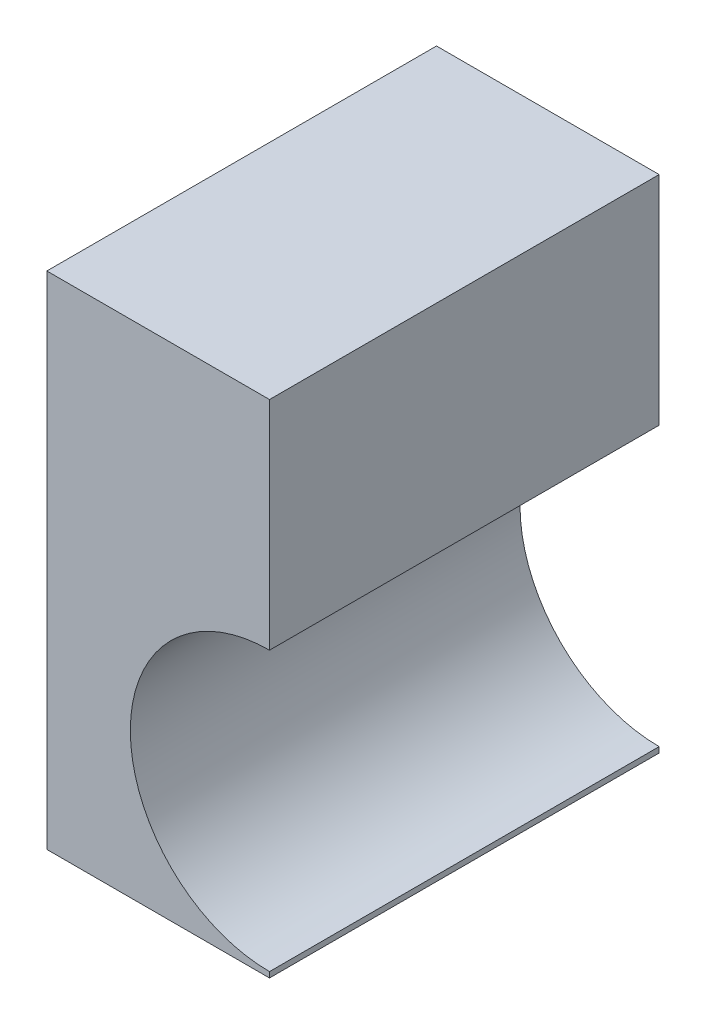
ISO-10303-21;
HEADER;
FILE_DESCRIPTION(('STEP AP214'),'2;1');
FILE_NAME('part.step','',(''),(''),'','','');
FILE_SCHEMA(('AUTOMOTIVE_DESIGN { 1 0 10303 214 1 1 1 1 }'));
ENDSEC;
DATA;
#1=APPLICATION_CONTEXT('core data for automotive mechanical design processes');
#2=APPLICATION_PROTOCOL_DEFINITION('international standard','automotive_design',2000,#1);
#3=PRODUCT_CONTEXT('',#1,'mechanical');
#4=PRODUCT('Part','Part','',(#3));
#5=PRODUCT_RELATED_PRODUCT_CATEGORY('part','',(#4));
#6=PRODUCT_DEFINITION_FORMATION('','',#4);
#7=PRODUCT_DEFINITION_CONTEXT('part definition',#1,'design');
#8=PRODUCT_DEFINITION('design','',#6,#7);
#9=PRODUCT_DEFINITION_SHAPE('','',#8);
#10=(LENGTH_UNIT() NAMED_UNIT(*) SI_UNIT(.MILLI.,.METRE.));
#11=(NAMED_UNIT(*) PLANE_ANGLE_UNIT() SI_UNIT($,.RADIAN.));
#12=(NAMED_UNIT(*) SI_UNIT($,.STERADIAN.) SOLID_ANGLE_UNIT());
#13=UNCERTAINTY_MEASURE_WITH_UNIT(LENGTH_MEASURE(1.E-05),#10,'distance_accuracy_value','');
#14=(GEOMETRIC_REPRESENTATION_CONTEXT(3) GLOBAL_UNCERTAINTY_ASSIGNED_CONTEXT((#13)) GLOBAL_UNIT_ASSIGNED_CONTEXT((#10,
#11,#12)) REPRESENTATION_CONTEXT('',''));
#15=CARTESIAN_POINT('',(0.,0.,0.));
#16=DIRECTION('',(0.,0.,1.));
#17=DIRECTION('',(1.,0.,0.));
#18=AXIS2_PLACEMENT_3D('',#15,#16,#17);
#19=CARTESIAN_POINT('',(-20.,0.,35.));
#20=DIRECTION('',(0.,1.,0.));
#21=DIRECTION('',(0.,0.,1.));
#22=AXIS2_PLACEMENT_3D('',#19,#20,#21);
#23=PLANE('',#22);
#24=DIRECTION('',(1.,0.,0.));
#25=VECTOR('',#24,1.);
#26=CARTESIAN_POINT('',(-20.,0.,0.));
#27=LINE('',#26,#25);
#28=CARTESIAN_POINT('',(-20.,0.,0.));
#29=VERTEX_POINT('',#28);
#30=CARTESIAN_POINT('',(0.,0.,0.));
#31=VERTEX_POINT('',#30);
#32=EDGE_CURVE('E121',#29,#31,#27,.T.);
#33=ORIENTED_EDGE('',*,*,#32,.T.);
#34=DIRECTION('',(0.,0.,-1.));
#35=VECTOR('',#34,1.);
#36=CARTESIAN_POINT('',(0.,0.,35.));
#37=LINE('',#36,#35);
#38=CARTESIAN_POINT('',(0.,0.,35.));
#39=VERTEX_POINT('',#38);
#40=EDGE_CURVE('E11',#39,#31,#37,.T.);
#41=ORIENTED_EDGE('',*,*,#40,.F.);
#42=DIRECTION('',(1.,0.,0.));
#43=VECTOR('',#42,1.);
#44=CARTESIAN_POINT('',(-20.,0.,35.));
#45=LINE('',#44,#43);
#46=CARTESIAN_POINT('',(-20.,0.,35.));
#47=VERTEX_POINT('',#46);
#48=EDGE_CURVE('E131',#47,#39,#45,.T.);
#49=ORIENTED_EDGE('',*,*,#48,.F.);
#50=DIRECTION('',(0.,0.,-1.));
#51=VECTOR('',#50,1.);
#52=CARTESIAN_POINT('',(-20.,0.,35.));
#53=LINE('',#52,#51);
#54=EDGE_CURVE('E117',#47,#29,#53,.T.);
#55=ORIENTED_EDGE('',*,*,#54,.T.);
#56=EDGE_LOOP('',(#33,#41,#49,#55));
#57=FACE_BOUND('',#56,.T.);
#58=ADVANCED_FACE('F37',(#57),#23,.F.);
#59=CARTESIAN_POINT('',(0.,0.,35.));
#60=DIRECTION('',(-1.,0.,0.));
#61=DIRECTION('',(0.,0.,1.));
#62=AXIS2_PLACEMENT_3D('',#59,#60,#61);
#63=PLANE('',#62);
#64=DIRECTION('',(0.,1.,0.));
#65=VECTOR('',#64,1.);
#66=CARTESIAN_POINT('',(0.,0.,0.));
#67=LINE('',#66,#65);
#68=CARTESIAN_POINT('',(0.,0.5,0.));
#69=VERTEX_POINT('',#68);
#70=EDGE_CURVE('E124',#31,#69,#67,.T.);
#71=ORIENTED_EDGE('',*,*,#70,.T.);
#72=DIRECTION('',(0.,0.,-1.));
#73=VECTOR('',#72,1.);
#74=CARTESIAN_POINT('',(0.,0.5,35.));
#75=LINE('',#74,#73);
#76=CARTESIAN_POINT('',(0.,0.5,35.));
#77=VERTEX_POINT('',#76);
#78=EDGE_CURVE('E45',#77,#69,#75,.T.);
#79=ORIENTED_EDGE('',*,*,#78,.F.);
#80=DIRECTION('',(0.,1.,0.));
#81=VECTOR('',#80,1.);
#82=CARTESIAN_POINT('',(0.,0.,35.));
#83=LINE('',#82,#81);
#84=EDGE_CURVE('E90',#39,#77,#83,.T.);
#85=ORIENTED_EDGE('',*,*,#84,.F.);
#86=ORIENTED_EDGE('',*,*,#40,.T.);
#87=EDGE_LOOP('',(#71,#79,#85,#86));
#88=FACE_BOUND('',#87,.T.);
#89=ADVANCED_FACE('F155',(#88),#63,.F.);
#90=CARTESIAN_POINT('',(0.,13.,35.));
#91=DIRECTION('',(0.,0.,-1.));
#92=DIRECTION('',(-1.,0.,0.));
#93=AXIS2_PLACEMENT_3D('',#90,#91,#92);
#94=CYLINDRICAL_SURFACE('',#93,12.5);
#95=CARTESIAN_POINT('',(0.,13.,0.));
#96=DIRECTION('',(0.,0.,-1.));
#97=DIRECTION('',(-1.,0.,0.));
#98=AXIS2_PLACEMENT_3D('',#95,#96,#97);
#99=CIRCLE('',#98,12.5);
#100=CARTESIAN_POINT('',(0.,25.5,0.));
#101=VERTEX_POINT('',#100);
#102=EDGE_CURVE('E126',#69,#101,#99,.T.);
#103=ORIENTED_EDGE('',*,*,#102,.T.);
#104=DIRECTION('',(0.,0.,-1.));
#105=VECTOR('',#104,1.);
#106=CARTESIAN_POINT('',(0.,25.5,35.));
#107=LINE('',#106,#105);
#108=CARTESIAN_POINT('',(0.,25.5,35.));
#109=VERTEX_POINT('',#108);
#110=EDGE_CURVE('E112',#109,#101,#107,.T.);
#111=ORIENTED_EDGE('',*,*,#110,.F.);
#112=CARTESIAN_POINT('',(0.,13.,35.));
#113=DIRECTION('',(0.,0.,-1.));
#114=DIRECTION('',(-1.,0.,0.));
#115=AXIS2_PLACEMENT_3D('',#112,#113,#114);
#116=CIRCLE('',#115,12.5);
#117=EDGE_CURVE('E103',#77,#109,#116,.T.);
#118=ORIENTED_EDGE('',*,*,#117,.F.);
#119=ORIENTED_EDGE('',*,*,#78,.T.);
#120=EDGE_LOOP('',(#103,#111,#118,#119));
#121=FACE_BOUND('',#120,.T.);
#122=ADVANCED_FACE('F137',(#121),#94,.F.);
#123=CARTESIAN_POINT('',(0.,25.5,35.));
#124=DIRECTION('',(-1.,0.,0.));
#125=DIRECTION('',(0.,0.,1.));
#126=AXIS2_PLACEMENT_3D('',#123,#124,#125);
#127=PLANE('',#126);
#128=DIRECTION('',(0.,1.,0.));
#129=VECTOR('',#128,1.);
#130=CARTESIAN_POINT('',(0.,25.5,0.));
#131=LINE('',#130,#129);
#132=CARTESIAN_POINT('',(0.,45.,0.));
#133=VERTEX_POINT('',#132);
#134=EDGE_CURVE('E111',#101,#133,#131,.T.);
#135=ORIENTED_EDGE('',*,*,#134,.T.);
#136=DIRECTION('',(0.,0.,-1.));
#137=VECTOR('',#136,1.);
#138=CARTESIAN_POINT('',(0.,45.,35.));
#139=LINE('',#138,#137);
#140=CARTESIAN_POINT('',(0.,45.,35.));
#141=VERTEX_POINT('',#140);
#142=EDGE_CURVE('E108',#141,#133,#139,.T.);
#143=ORIENTED_EDGE('',*,*,#142,.F.);
#144=DIRECTION('',(0.,1.,0.));
#145=VECTOR('',#144,1.);
#146=CARTESIAN_POINT('',(0.,25.5,35.));
#147=LINE('',#146,#145);
#148=EDGE_CURVE('E97',#109,#141,#147,.T.);
#149=ORIENTED_EDGE('',*,*,#148,.F.);
#150=ORIENTED_EDGE('',*,*,#110,.T.);
#151=EDGE_LOOP('',(#135,#143,#149,#150));
#152=FACE_BOUND('',#151,.T.);
#153=ADVANCED_FACE('F109',(#152),#127,.F.);
#154=CARTESIAN_POINT('',(0.,45.,35.));
#155=DIRECTION('',(0.,-1.,0.));
#156=DIRECTION('',(0.,0.,-1.));
#157=AXIS2_PLACEMENT_3D('',#154,#155,#156);
#158=PLANE('',#157);
#159=DIRECTION('',(-1.,0.,0.));
#160=VECTOR('',#159,1.);
#161=CARTESIAN_POINT('',(0.,45.,0.));
#162=LINE('',#161,#160);
#163=CARTESIAN_POINT('',(-20.,45.,0.));
#164=VERTEX_POINT('',#163);
#165=EDGE_CURVE('E76',#133,#164,#162,.T.);
#166=ORIENTED_EDGE('',*,*,#165,.T.);
#167=DIRECTION('',(0.,0.,-1.));
#168=VECTOR('',#167,1.);
#169=CARTESIAN_POINT('',(-20.,45.,35.));
#170=LINE('',#169,#168);
#171=CARTESIAN_POINT('',(-20.,45.,35.));
#172=VERTEX_POINT('',#171);
#173=EDGE_CURVE('E113',#172,#164,#170,.T.);
#174=ORIENTED_EDGE('',*,*,#173,.F.);
#175=DIRECTION('',(-1.,0.,0.));
#176=VECTOR('',#175,1.);
#177=CARTESIAN_POINT('',(0.,45.,35.));
#178=LINE('',#177,#176);
#179=EDGE_CURVE('E101',#141,#172,#178,.T.);
#180=ORIENTED_EDGE('',*,*,#179,.F.);
#181=ORIENTED_EDGE('',*,*,#142,.T.);
#182=EDGE_LOOP('',(#166,#174,#180,#181));
#183=FACE_BOUND('',#182,.T.);
#184=ADVANCED_FACE('F115',(#183),#158,.F.);
#185=CARTESIAN_POINT('',(-20.,45.,35.));
#186=DIRECTION('',(1.,0.,0.));
#187=DIRECTION('',(0.,1.,0.));
#188=AXIS2_PLACEMENT_3D('',#185,#186,#187);
#189=PLANE('',#188);
#190=DIRECTION('',(0.,-1.,0.));
#191=VECTOR('',#190,1.);
#192=CARTESIAN_POINT('',(-20.,45.,0.));
#193=LINE('',#192,#191);
#194=EDGE_CURVE('E82',#164,#29,#193,.T.);
#195=ORIENTED_EDGE('',*,*,#194,.T.);
#196=ORIENTED_EDGE('',*,*,#54,.F.);
#197=DIRECTION('',(0.,-1.,0.));
#198=VECTOR('',#197,1.);
#199=CARTESIAN_POINT('',(-20.,45.,35.));
#200=LINE('',#199,#198);
#201=EDGE_CURVE('E53',#172,#47,#200,.T.);
#202=ORIENTED_EDGE('',*,*,#201,.F.);
#203=ORIENTED_EDGE('',*,*,#173,.T.);
#204=EDGE_LOOP('',(#195,#196,#202,#203));
#205=FACE_BOUND('',#204,.T.);
#206=ADVANCED_FACE('F144',(#205),#189,.F.);
#207=CARTESIAN_POINT('',(0.,13.,35.));
#208=DIRECTION('',(0.,0.,-1.));
#209=DIRECTION('',(-1.,0.,0.));
#210=AXIS2_PLACEMENT_3D('',#207,#208,#209);
#211=PLANE('',#210);
#212=ORIENTED_EDGE('',*,*,#48,.T.);
#213=ORIENTED_EDGE('',*,*,#84,.T.);
#214=ORIENTED_EDGE('',*,*,#117,.T.);
#215=ORIENTED_EDGE('',*,*,#148,.T.);
#216=ORIENTED_EDGE('',*,*,#179,.T.);
#217=ORIENTED_EDGE('',*,*,#201,.T.);
#218=EDGE_LOOP('',(#212,#213,#214,#215,#216,#217));
#219=FACE_BOUND('',#218,.T.);
#220=ADVANCED_FACE('F99',(#219),#211,.F.);
#221=CARTESIAN_POINT('',(0.,13.,0.));
#222=DIRECTION('',(0.,0.,-1.));
#223=DIRECTION('',(-1.,0.,0.));
#224=AXIS2_PLACEMENT_3D('',#221,#222,#223);
#225=PLANE('',#224);
#226=ORIENTED_EDGE('',*,*,#32,.F.);
#227=ORIENTED_EDGE('',*,*,#194,.F.);
#228=ORIENTED_EDGE('',*,*,#165,.F.);
#229=ORIENTED_EDGE('',*,*,#134,.F.);
#230=ORIENTED_EDGE('',*,*,#102,.F.);
#231=ORIENTED_EDGE('',*,*,#70,.F.);
#232=EDGE_LOOP('',(#226,#227,#228,#229,#230,#231));
#233=FACE_BOUND('',#232,.T.);
#234=ADVANCED_FACE('F140',(#233),#225,.T.);
#235=CLOSED_SHELL('',(#58,#89,#122,#153,#184,#206,#220,#234));
#236=MANIFOLD_SOLID_BREP('B2',#235);
#237=ADVANCED_BREP_SHAPE_REPRESENTATION('',(#18,#236),#14);
#238=SHAPE_DEFINITION_REPRESENTATION(#9,#237);
ENDSEC;
END-ISO-10303-21;
